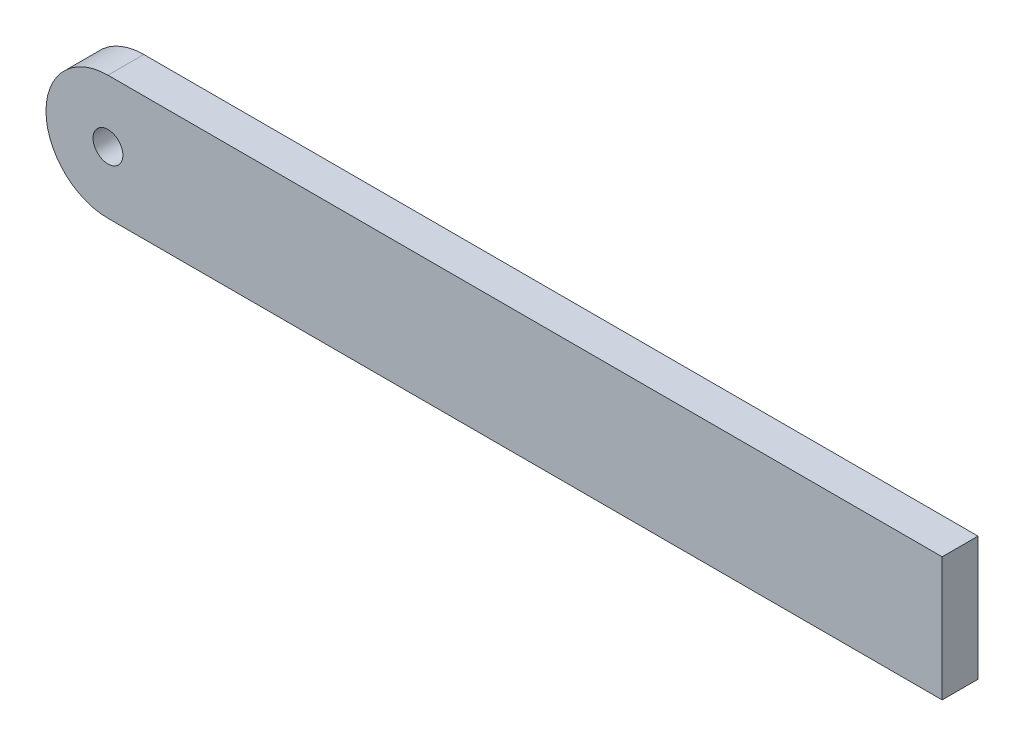
ISO-10303-21;
HEADER;
FILE_DESCRIPTION(('STEP AP214'),'2;1');
FILE_NAME('part.step','',(''),(''),'','','');
FILE_SCHEMA(('AUTOMOTIVE_DESIGN { 1 0 10303 214 1 1 1 1 }'));
ENDSEC;
DATA;
#1=APPLICATION_CONTEXT('core data for automotive mechanical design processes');
#2=APPLICATION_PROTOCOL_DEFINITION('international standard','automotive_design',2000,#1);
#3=PRODUCT_CONTEXT('',#1,'mechanical');
#4=PRODUCT('Part','Part','',(#3));
#5=PRODUCT_RELATED_PRODUCT_CATEGORY('part','',(#4));
#6=PRODUCT_DEFINITION_FORMATION('','',#4);
#7=PRODUCT_DEFINITION_CONTEXT('part definition',#1,'design');
#8=PRODUCT_DEFINITION('design','',#6,#7);
#9=PRODUCT_DEFINITION_SHAPE('','',#8);
#10=(LENGTH_UNIT() NAMED_UNIT(*) SI_UNIT(.MILLI.,.METRE.));
#11=(NAMED_UNIT(*) PLANE_ANGLE_UNIT() SI_UNIT($,.RADIAN.));
#12=(NAMED_UNIT(*) SI_UNIT($,.STERADIAN.) SOLID_ANGLE_UNIT());
#13=UNCERTAINTY_MEASURE_WITH_UNIT(LENGTH_MEASURE(1.E-05),#10,'distance_accuracy_value','');
#14=(GEOMETRIC_REPRESENTATION_CONTEXT(3) GLOBAL_UNCERTAINTY_ASSIGNED_CONTEXT((#13)) GLOBAL_UNIT_ASSIGNED_CONTEXT((#10,
#11,#12)) REPRESENTATION_CONTEXT('',''));
#15=CARTESIAN_POINT('',(0.,0.,0.));
#16=DIRECTION('',(0.,0.,1.));
#17=DIRECTION('',(1.,0.,0.));
#18=AXIS2_PLACEMENT_3D('',#15,#16,#17);
#19=CARTESIAN_POINT('',(-64.63,-0.00500000000000327,6.));
#20=DIRECTION('',(0.,0.,1.));
#21=DIRECTION('',(1.,0.,0.));
#22=AXIS2_PLACEMENT_3D('',#19,#20,#21);
#23=PLANE('',#22);
#24=DIRECTION('',(0.,1.,0.));
#25=VECTOR('',#24,1.);
#26=CARTESIAN_POINT('',(75.,10.375,6.));
#27=LINE('',#26,#25);
#28=CARTESIAN_POINT('',(75.,-10.375,6.));
#29=VERTEX_POINT('',#28);
#30=CARTESIAN_POINT('',(75.,10.375,6.));
#31=VERTEX_POINT('',#30);
#32=EDGE_CURVE('E129',#29,#31,#27,.T.);
#33=ORIENTED_EDGE('',*,*,#32,.T.);
#34=DIRECTION('',(-1.,0.,0.));
#35=VECTOR('',#34,1.);
#36=CARTESIAN_POINT('',(-64.6299999999999,10.375,6.));
#37=LINE('',#36,#35);
#38=CARTESIAN_POINT('',(-64.6299999999999,10.375,6.));
#39=VERTEX_POINT('',#38);
#40=EDGE_CURVE('E87',#31,#39,#37,.T.);
#41=ORIENTED_EDGE('',*,*,#40,.T.);
#42=CARTESIAN_POINT('',(-64.63,0.00500000000000327,6.));
#43=DIRECTION('',(0.,0.,1.));
#44=DIRECTION('',(1.,0.,0.));
#45=AXIS2_PLACEMENT_3D('',#42,#43,#44);
#46=CIRCLE('',#45,10.37);
#47=CARTESIAN_POINT('',(-75.,0.00499999999992867,6.));
#48=VERTEX_POINT('',#47);
#49=EDGE_CURVE('E100',#39,#48,#46,.T.);
#50=ORIENTED_EDGE('',*,*,#49,.T.);
#51=DIRECTION('',(0.,-1.,0.));
#52=VECTOR('',#51,1.);
#53=CARTESIAN_POINT('',(-75.,0.00499999999992867,6.));
#54=LINE('',#53,#52);
#55=CARTESIAN_POINT('',(-75.,-0.00499999999992831,6.));
#56=VERTEX_POINT('',#55);
#57=EDGE_CURVE('E94',#48,#56,#54,.T.);
#58=ORIENTED_EDGE('',*,*,#57,.T.);
#59=CARTESIAN_POINT('',(-64.63,-0.00500000000000327,6.));
#60=DIRECTION('',(0.,0.,1.));
#61=DIRECTION('',(1.,0.,0.));
#62=AXIS2_PLACEMENT_3D('',#59,#60,#61);
#63=CIRCLE('',#62,10.37);
#64=CARTESIAN_POINT('',(-64.6299999999999,-10.375,6.));
#65=VERTEX_POINT('',#64);
#66=EDGE_CURVE('E98',#56,#65,#63,.T.);
#67=ORIENTED_EDGE('',*,*,#66,.T.);
#68=DIRECTION('',(1.,0.,0.));
#69=VECTOR('',#68,1.);
#70=CARTESIAN_POINT('',(-64.6299999999999,-10.375,6.));
#71=LINE('',#70,#69);
#72=EDGE_CURVE('E50',#65,#29,#71,.T.);
#73=ORIENTED_EDGE('',*,*,#72,.T.);
#74=EDGE_LOOP('',(#33,#41,#50,#58,#67,#73));
#75=FACE_BOUND('',#74,.T.);
#76=CARTESIAN_POINT('',(-64.63,0.00500000000000327,6.));
#77=DIRECTION('',(0.,0.,1.));
#78=DIRECTION('',(1.,0.,0.));
#79=AXIS2_PLACEMENT_3D('',#76,#77,#78);
#80=CIRCLE('',#79,2.5);
#81=CARTESIAN_POINT('',(-62.13,0.00500000000000327,6.));
#82=VERTEX_POINT('',#81);
#83=EDGE_CURVE('E122',#82,#82,#80,.T.);
#84=ORIENTED_EDGE('',*,*,#83,.F.);
#85=EDGE_LOOP('',(#84));
#86=FACE_BOUND('',#85,.T.);
#87=ADVANCED_FACE('F33',(#75,#86),#23,.T.);
#88=CARTESIAN_POINT('',(-64.63,-0.00500000000000327,0.));
#89=DIRECTION('',(0.,0.,1.));
#90=DIRECTION('',(1.,0.,0.));
#91=AXIS2_PLACEMENT_3D('',#88,#89,#90);
#92=PLANE('',#91);
#93=DIRECTION('',(0.,1.,0.));
#94=VECTOR('',#93,1.);
#95=CARTESIAN_POINT('',(75.,10.375,0.));
#96=LINE('',#95,#94);
#97=CARTESIAN_POINT('',(75.,-10.375,0.));
#98=VERTEX_POINT('',#97);
#99=CARTESIAN_POINT('',(75.,10.375,0.));
#100=VERTEX_POINT('',#99);
#101=EDGE_CURVE('E118',#98,#100,#96,.T.);
#102=ORIENTED_EDGE('',*,*,#101,.F.);
#103=DIRECTION('',(1.,0.,0.));
#104=VECTOR('',#103,1.);
#105=CARTESIAN_POINT('',(-64.6299999999999,-10.375,0.));
#106=LINE('',#105,#104);
#107=CARTESIAN_POINT('',(-64.6299999999999,-10.375,0.));
#108=VERTEX_POINT('',#107);
#109=EDGE_CURVE('E79',#108,#98,#106,.T.);
#110=ORIENTED_EDGE('',*,*,#109,.F.);
#111=CARTESIAN_POINT('',(-64.63,-0.00500000000000327,0.));
#112=DIRECTION('',(0.,0.,1.));
#113=DIRECTION('',(1.,0.,0.));
#114=AXIS2_PLACEMENT_3D('',#111,#112,#113);
#115=CIRCLE('',#114,10.37);
#116=CARTESIAN_POINT('',(-75.,-0.00499999999992831,0.));
#117=VERTEX_POINT('',#116);
#118=EDGE_CURVE('E73',#117,#108,#115,.T.);
#119=ORIENTED_EDGE('',*,*,#118,.F.);
#120=DIRECTION('',(0.,-1.,0.));
#121=VECTOR('',#120,1.);
#122=CARTESIAN_POINT('',(-75.,0.00499999999992867,0.));
#123=LINE('',#122,#121);
#124=CARTESIAN_POINT('',(-75.,0.00499999999992867,0.));
#125=VERTEX_POINT('',#124);
#126=EDGE_CURVE('E108',#125,#117,#123,.T.);
#127=ORIENTED_EDGE('',*,*,#126,.F.);
#128=CARTESIAN_POINT('',(-64.63,0.00500000000000327,0.));
#129=DIRECTION('',(0.,0.,1.));
#130=DIRECTION('',(1.,0.,0.));
#131=AXIS2_PLACEMENT_3D('',#128,#129,#130);
#132=CIRCLE('',#131,10.37);
#133=CARTESIAN_POINT('',(-64.6299999999999,10.375,0.));
#134=VERTEX_POINT('',#133);
#135=EDGE_CURVE('E124',#134,#125,#132,.T.);
#136=ORIENTED_EDGE('',*,*,#135,.F.);
#137=DIRECTION('',(-1.,0.,0.));
#138=VECTOR('',#137,1.);
#139=CARTESIAN_POINT('',(-64.6299999999999,10.375,0.));
#140=LINE('',#139,#138);
#141=EDGE_CURVE('E121',#100,#134,#140,.T.);
#142=ORIENTED_EDGE('',*,*,#141,.F.);
#143=EDGE_LOOP('',(#102,#110,#119,#127,#136,#142));
#144=FACE_BOUND('',#143,.T.);
#145=CARTESIAN_POINT('',(-64.63,0.00500000000000327,0.));
#146=DIRECTION('',(0.,0.,1.));
#147=DIRECTION('',(1.,0.,0.));
#148=AXIS2_PLACEMENT_3D('',#145,#146,#147);
#149=CIRCLE('',#148,2.5);
#150=CARTESIAN_POINT('',(-62.13,0.00500000000000327,0.));
#151=VERTEX_POINT('',#150);
#152=EDGE_CURVE('E222',#151,#151,#149,.T.);
#153=ORIENTED_EDGE('',*,*,#152,.T.);
#154=EDGE_LOOP('',(#153));
#155=FACE_BOUND('',#154,.T.);
#156=ADVANCED_FACE('F138',(#144,#155),#92,.F.);
#157=CARTESIAN_POINT('',(75.,10.375,6.));
#158=DIRECTION('',(-1.,0.,0.));
#159=DIRECTION('',(0.,0.,1.));
#160=AXIS2_PLACEMENT_3D('',#157,#158,#159);
#161=PLANE('',#160);
#162=ORIENTED_EDGE('',*,*,#101,.T.);
#163=DIRECTION('',(0.,0.,-1.));
#164=VECTOR('',#163,1.);
#165=CARTESIAN_POINT('',(75.,10.375,6.));
#166=LINE('',#165,#164);
#167=EDGE_CURVE('E11',#31,#100,#166,.T.);
#168=ORIENTED_EDGE('',*,*,#167,.F.);
#169=ORIENTED_EDGE('',*,*,#32,.F.);
#170=DIRECTION('',(0.,0.,-1.));
#171=VECTOR('',#170,1.);
#172=CARTESIAN_POINT('',(75.,-10.375,6.));
#173=LINE('',#172,#171);
#174=EDGE_CURVE('E114',#29,#98,#173,.T.);
#175=ORIENTED_EDGE('',*,*,#174,.T.);
#176=EDGE_LOOP('',(#162,#168,#169,#175));
#177=FACE_BOUND('',#176,.T.);
#178=ADVANCED_FACE('F35',(#177),#161,.F.);
#179=CARTESIAN_POINT('',(-64.6299999999999,10.375,6.));
#180=DIRECTION('',(0.,-1.,0.));
#181=DIRECTION('',(0.,0.,-1.));
#182=AXIS2_PLACEMENT_3D('',#179,#180,#181);
#183=PLANE('',#182);
#184=ORIENTED_EDGE('',*,*,#141,.T.);
#185=DIRECTION('',(0.,0.,-1.));
#186=VECTOR('',#185,1.);
#187=CARTESIAN_POINT('',(-64.6299999999999,10.375,6.));
#188=LINE('',#187,#186);
#189=EDGE_CURVE('E42',#39,#134,#188,.T.);
#190=ORIENTED_EDGE('',*,*,#189,.F.);
#191=ORIENTED_EDGE('',*,*,#40,.F.);
#192=ORIENTED_EDGE('',*,*,#167,.T.);
#193=EDGE_LOOP('',(#184,#190,#191,#192));
#194=FACE_BOUND('',#193,.T.);
#195=ADVANCED_FACE('F163',(#194),#183,.F.);
#196=CARTESIAN_POINT('',(-64.63,0.00500000000000327,6.));
#197=DIRECTION('',(0.,0.,-1.));
#198=DIRECTION('',(-1.,0.,0.));
#199=AXIS2_PLACEMENT_3D('',#196,#197,#198);
#200=CYLINDRICAL_SURFACE('',#199,10.37);
#201=ORIENTED_EDGE('',*,*,#135,.T.);
#202=DIRECTION('',(0.,0.,-1.));
#203=VECTOR('',#202,1.);
#204=CARTESIAN_POINT('',(-75.,0.00499999999992867,6.));
#205=LINE('',#204,#203);
#206=EDGE_CURVE('E109',#48,#125,#205,.T.);
#207=ORIENTED_EDGE('',*,*,#206,.F.);
#208=ORIENTED_EDGE('',*,*,#49,.F.);
#209=ORIENTED_EDGE('',*,*,#189,.T.);
#210=EDGE_LOOP('',(#201,#207,#208,#209));
#211=FACE_BOUND('',#210,.T.);
#212=ADVANCED_FACE('F135',(#211),#200,.T.);
#213=CARTESIAN_POINT('',(-75.,0.00499999999992867,6.));
#214=DIRECTION('',(1.,0.,0.));
#215=DIRECTION('',(0.,0.,-1.));
#216=AXIS2_PLACEMENT_3D('',#213,#214,#215);
#217=PLANE('',#216);
#218=ORIENTED_EDGE('',*,*,#126,.T.);
#219=DIRECTION('',(0.,0.,-1.));
#220=VECTOR('',#219,1.);
#221=CARTESIAN_POINT('',(-75.,-0.00499999999992831,6.));
#222=LINE('',#221,#220);
#223=EDGE_CURVE('E105',#56,#117,#222,.T.);
#224=ORIENTED_EDGE('',*,*,#223,.F.);
#225=ORIENTED_EDGE('',*,*,#57,.F.);
#226=ORIENTED_EDGE('',*,*,#206,.T.);
#227=EDGE_LOOP('',(#218,#224,#225,#226));
#228=FACE_BOUND('',#227,.T.);
#229=ADVANCED_FACE('F106',(#228),#217,.F.);
#230=CARTESIAN_POINT('',(-64.63,-0.00500000000000327,6.));
#231=DIRECTION('',(0.,0.,-1.));
#232=DIRECTION('',(-1.,0.,0.));
#233=AXIS2_PLACEMENT_3D('',#230,#231,#232);
#234=CYLINDRICAL_SURFACE('',#233,10.37);
#235=ORIENTED_EDGE('',*,*,#118,.T.);
#236=DIRECTION('',(0.,0.,-1.));
#237=VECTOR('',#236,1.);
#238=CARTESIAN_POINT('',(-64.6299999999999,-10.375,6.));
#239=LINE('',#238,#237);
#240=EDGE_CURVE('E110',#65,#108,#239,.T.);
#241=ORIENTED_EDGE('',*,*,#240,.F.);
#242=ORIENTED_EDGE('',*,*,#66,.F.);
#243=ORIENTED_EDGE('',*,*,#223,.T.);
#244=EDGE_LOOP('',(#235,#241,#242,#243));
#245=FACE_BOUND('',#244,.T.);
#246=ADVANCED_FACE('F112',(#245),#234,.T.);
#247=CARTESIAN_POINT('',(-64.6299999999999,-10.375,6.));
#248=DIRECTION('',(0.,1.,0.));
#249=DIRECTION('',(0.,0.,1.));
#250=AXIS2_PLACEMENT_3D('',#247,#248,#249);
#251=PLANE('',#250);
#252=ORIENTED_EDGE('',*,*,#109,.T.);
#253=ORIENTED_EDGE('',*,*,#174,.F.);
#254=ORIENTED_EDGE('',*,*,#72,.F.);
#255=ORIENTED_EDGE('',*,*,#240,.T.);
#256=EDGE_LOOP('',(#252,#253,#254,#255));
#257=FACE_BOUND('',#256,.T.);
#258=ADVANCED_FACE('F143',(#257),#251,.F.);
#259=CARTESIAN_POINT('',(-64.63,0.00500000000000327,6.));
#260=DIRECTION('',(0.,0.,-1.));
#261=DIRECTION('',(-1.,0.,0.));
#262=AXIS2_PLACEMENT_3D('',#259,#260,#261);
#263=CYLINDRICAL_SURFACE('',#262,2.5);
#264=ORIENTED_EDGE('',*,*,#83,.T.);
#265=EDGE_LOOP('',(#264));
#266=FACE_BOUND('',#265,.T.);
#267=ORIENTED_EDGE('',*,*,#152,.F.);
#268=EDGE_LOOP('',(#267));
#269=FACE_BOUND('',#268,.T.);
#270=ADVANCED_FACE('F145',(#266,#269),#263,.F.);
#271=CLOSED_SHELL('',(#87,#156,#178,#195,#212,#229,#246,#258,#270));
#272=MANIFOLD_SOLID_BREP('B2',#271);
#273=ADVANCED_BREP_SHAPE_REPRESENTATION('',(#18,#272),#14);
#274=SHAPE_DEFINITION_REPRESENTATION(#9,#273);
ENDSEC;
END-ISO-10303-21;
